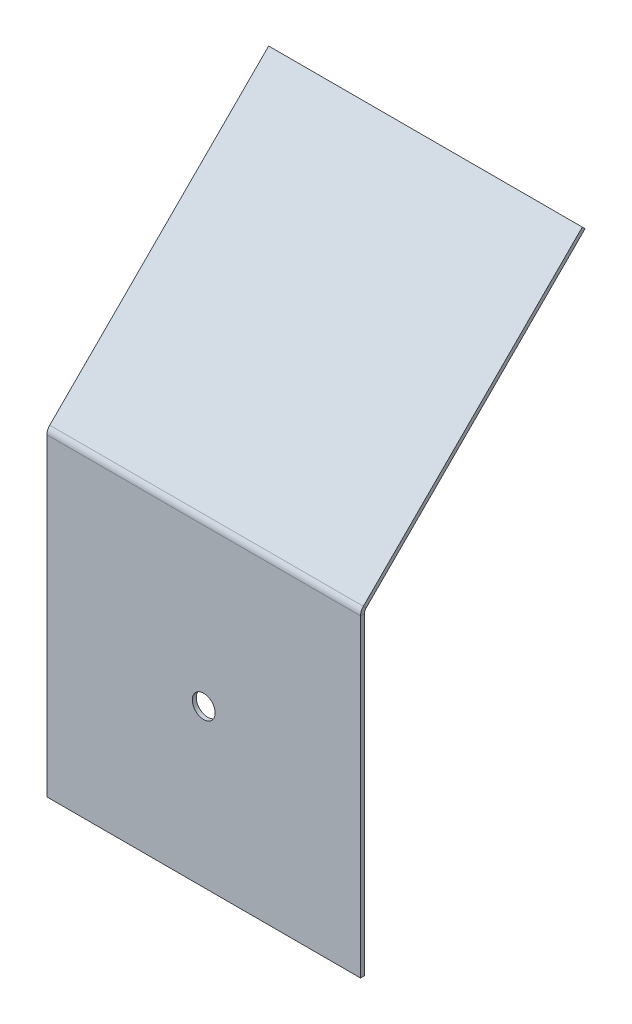
ISO-10303-21;
HEADER;
FILE_DESCRIPTION(('STEP AP214'),'2;1');
FILE_NAME('part.step','',(''),(''),'','','');
FILE_SCHEMA(('AUTOMOTIVE_DESIGN { 1 0 10303 214 1 1 1 1 }'));
ENDSEC;
DATA;
#1=APPLICATION_CONTEXT('core data for automotive mechanical design processes');
#2=APPLICATION_PROTOCOL_DEFINITION('international standard','automotive_design',2000,#1);
#3=PRODUCT_CONTEXT('',#1,'mechanical');
#4=PRODUCT('Part','Part','',(#3));
#5=PRODUCT_RELATED_PRODUCT_CATEGORY('part','',(#4));
#6=PRODUCT_DEFINITION_FORMATION('','',#4);
#7=PRODUCT_DEFINITION_CONTEXT('part definition',#1,'design');
#8=PRODUCT_DEFINITION('design','',#6,#7);
#9=PRODUCT_DEFINITION_SHAPE('','',#8);
#10=(LENGTH_UNIT() NAMED_UNIT(*) SI_UNIT(.MILLI.,.METRE.));
#11=(NAMED_UNIT(*) PLANE_ANGLE_UNIT() SI_UNIT($,.RADIAN.));
#12=(NAMED_UNIT(*) SI_UNIT($,.STERADIAN.) SOLID_ANGLE_UNIT());
#13=UNCERTAINTY_MEASURE_WITH_UNIT(LENGTH_MEASURE(1.E-05),#10,'distance_accuracy_value','');
#14=(GEOMETRIC_REPRESENTATION_CONTEXT(3) GLOBAL_UNCERTAINTY_ASSIGNED_CONTEXT((#13)) GLOBAL_UNIT_ASSIGNED_CONTEXT((#10,
#11,#12)) REPRESENTATION_CONTEXT('',''));
#15=CARTESIAN_POINT('',(0.,0.,0.));
#16=DIRECTION('',(0.,0.,1.));
#17=DIRECTION('',(1.,0.,0.));
#18=AXIS2_PLACEMENT_3D('',#15,#16,#17);
#19=CARTESIAN_POINT('',(27.5,-27.5,-0.7));
#20=DIRECTION('',(1.,0.,0.));
#21=DIRECTION('',(0.,0.,-1.));
#22=AXIS2_PLACEMENT_3D('',#19,#20,#21);
#23=PLANE('',#22);
#24=DIRECTION('',(0.,1.,0.));
#25=VECTOR('',#24,1.);
#26=CARTESIAN_POINT('',(27.5,-27.5,0.));
#27=LINE('',#26,#25);
#28=CARTESIAN_POINT('',(27.5,-27.5,0.));
#29=VERTEX_POINT('',#28);
#30=CARTESIAN_POINT('',(27.5,27.5,0.));
#31=VERTEX_POINT('',#30);
#32=EDGE_CURVE('E96',#29,#31,#27,.T.);
#33=ORIENTED_EDGE('',*,*,#32,.F.);
#34=DIRECTION('',(0.,0.,1.));
#35=VECTOR('',#34,1.);
#36=CARTESIAN_POINT('',(27.5,-27.5,-0.7));
#37=LINE('',#36,#35);
#38=CARTESIAN_POINT('',(27.5,-27.5,-0.7));
#39=VERTEX_POINT('',#38);
#40=EDGE_CURVE('E13',#39,#29,#37,.T.);
#41=ORIENTED_EDGE('',*,*,#40,.F.);
#42=DIRECTION('',(0.,1.,0.));
#43=VECTOR('',#42,1.);
#44=CARTESIAN_POINT('',(27.5,-27.5,-0.7));
#45=LINE('',#44,#43);
#46=CARTESIAN_POINT('',(27.5,27.5,-0.699999999999997));
#47=VERTEX_POINT('',#46);
#48=EDGE_CURVE('E105',#39,#47,#45,.T.);
#49=ORIENTED_EDGE('',*,*,#48,.T.);
#50=DIRECTION('',(0.,0.,1.));
#51=VECTOR('',#50,1.);
#52=CARTESIAN_POINT('',(27.5,27.5,-0.7));
#53=LINE('',#52,#51);
#54=EDGE_CURVE('E58',#47,#31,#53,.T.);
#55=ORIENTED_EDGE('',*,*,#54,.T.);
#56=EDGE_LOOP('',(#33,#41,#49,#55));
#57=FACE_BOUND('',#56,.T.);
#58=ADVANCED_FACE('F55',(#57),#23,.T.);
#59=CARTESIAN_POINT('',(-27.5,-27.5,-0.7));
#60=DIRECTION('',(0.,-1.,0.));
#61=DIRECTION('',(0.,0.,-1.));
#62=AXIS2_PLACEMENT_3D('',#59,#60,#61);
#63=PLANE('',#62);
#64=DIRECTION('',(1.,0.,0.));
#65=VECTOR('',#64,1.);
#66=CARTESIAN_POINT('',(-27.5,-27.5,0.));
#67=LINE('',#66,#65);
#68=CARTESIAN_POINT('',(-27.5,-27.5,0.));
#69=VERTEX_POINT('',#68);
#70=EDGE_CURVE('E91',#69,#29,#67,.T.);
#71=ORIENTED_EDGE('',*,*,#70,.F.);
#72=DIRECTION('',(0.,0.,1.));
#73=VECTOR('',#72,1.);
#74=CARTESIAN_POINT('',(-27.5,-27.5,-0.7));
#75=LINE('',#74,#73);
#76=CARTESIAN_POINT('',(-27.5,-27.5,-0.7));
#77=VERTEX_POINT('',#76);
#78=EDGE_CURVE('E64',#77,#69,#75,.T.);
#79=ORIENTED_EDGE('',*,*,#78,.F.);
#80=DIRECTION('',(1.,0.,0.));
#81=VECTOR('',#80,1.);
#82=CARTESIAN_POINT('',(-27.5,-27.5,-0.7));
#83=LINE('',#82,#81);
#84=EDGE_CURVE('E93',#77,#39,#83,.T.);
#85=ORIENTED_EDGE('',*,*,#84,.T.);
#86=ORIENTED_EDGE('',*,*,#40,.T.);
#87=EDGE_LOOP('',(#71,#79,#85,#86));
#88=FACE_BOUND('',#87,.T.);
#89=ADVANCED_FACE('F89',(#88),#63,.T.);
#90=CARTESIAN_POINT('',(-27.5,-27.5,-0.7));
#91=DIRECTION('',(-1.,0.,0.));
#92=DIRECTION('',(0.,0.,1.));
#93=AXIS2_PLACEMENT_3D('',#90,#91,#92);
#94=PLANE('',#93);
#95=DIRECTION('',(0.,-1.,0.));
#96=VECTOR('',#95,1.);
#97=CARTESIAN_POINT('',(-27.5,-27.5,0.));
#98=LINE('',#97,#96);
#99=CARTESIAN_POINT('',(-27.5,27.5,0.));
#100=VERTEX_POINT('',#99);
#101=EDGE_CURVE('E104',#100,#69,#98,.T.);
#102=ORIENTED_EDGE('',*,*,#101,.F.);
#103=DIRECTION('',(0.,0.,1.));
#104=VECTOR('',#103,1.);
#105=CARTESIAN_POINT('',(-27.5,27.5,-0.7));
#106=LINE('',#105,#104);
#107=CARTESIAN_POINT('',(-27.5,27.5,-0.700000000000002));
#108=VERTEX_POINT('',#107);
#109=EDGE_CURVE('E112',#108,#100,#106,.T.);
#110=ORIENTED_EDGE('',*,*,#109,.F.);
#111=DIRECTION('',(0.,-1.,0.));
#112=VECTOR('',#111,1.);
#113=CARTESIAN_POINT('',(-27.5,-27.5,-0.7));
#114=LINE('',#113,#112);
#115=EDGE_CURVE('E118',#108,#77,#114,.T.);
#116=ORIENTED_EDGE('',*,*,#115,.T.);
#117=ORIENTED_EDGE('',*,*,#78,.T.);
#118=EDGE_LOOP('',(#102,#110,#116,#117));
#119=FACE_BOUND('',#118,.T.);
#120=ADVANCED_FACE('F165',(#119),#94,.T.);
#121=CARTESIAN_POINT('',(0.,0.,-0.7));
#122=DIRECTION('',(0.,0.,-1.));
#123=DIRECTION('',(-1.,0.,0.));
#124=AXIS2_PLACEMENT_3D('',#121,#122,#123);
#125=PLANE('',#124);
#126=CARTESIAN_POINT('',(0.,0.,-0.699999999999999));
#127=DIRECTION('',(0.,0.,-1.));
#128=DIRECTION('',(-1.,0.,0.));
#129=AXIS2_PLACEMENT_3D('',#126,#127,#128);
#130=CIRCLE('',#129,2.);
#131=CARTESIAN_POINT('',(-2.,0.,-0.699999999999999));
#132=VERTEX_POINT('',#131);
#133=EDGE_CURVE('E198',#132,#132,#130,.T.);
#134=ORIENTED_EDGE('',*,*,#133,.F.);
#135=EDGE_LOOP('',(#134));
#136=FACE_BOUND('',#135,.T.);
#137=ORIENTED_EDGE('',*,*,#48,.F.);
#138=ORIENTED_EDGE('',*,*,#84,.F.);
#139=ORIENTED_EDGE('',*,*,#115,.F.);
#140=DIRECTION('',(-1.,0.,0.));
#141=VECTOR('',#140,1.);
#142=CARTESIAN_POINT('',(-27.5,27.5,-0.7));
#143=LINE('',#142,#141);
#144=EDGE_CURVE('E107',#47,#108,#143,.T.);
#145=ORIENTED_EDGE('',*,*,#144,.F.);
#146=EDGE_LOOP('',(#137,#138,#139,#145));
#147=FACE_BOUND('',#146,.T.);
#148=ADVANCED_FACE('F166',(#136,#147),#125,.T.);
#149=CARTESIAN_POINT('',(0.,0.,0.));
#150=DIRECTION('',(0.,0.,-1.));
#151=DIRECTION('',(-1.,0.,0.));
#152=AXIS2_PLACEMENT_3D('',#149,#150,#151);
#153=PLANE('',#152);
#154=CARTESIAN_POINT('',(0.,0.,0.));
#155=DIRECTION('',(0.,0.,1.));
#156=DIRECTION('',(1.,0.,0.));
#157=AXIS2_PLACEMENT_3D('',#154,#155,#156);
#158=CIRCLE('',#157,2.);
#159=CARTESIAN_POINT('',(2.,0.,0.));
#160=VERTEX_POINT('',#159);
#161=EDGE_CURVE('E228',#160,#160,#158,.T.);
#162=ORIENTED_EDGE('',*,*,#161,.F.);
#163=EDGE_LOOP('',(#162));
#164=FACE_BOUND('',#163,.T.);
#165=ORIENTED_EDGE('',*,*,#32,.T.);
#166=DIRECTION('',(-1.,0.,0.));
#167=VECTOR('',#166,1.);
#168=CARTESIAN_POINT('',(-27.5,27.5,0.));
#169=LINE('',#168,#167);
#170=EDGE_CURVE('E100',#31,#100,#169,.T.);
#171=ORIENTED_EDGE('',*,*,#170,.T.);
#172=ORIENTED_EDGE('',*,*,#101,.T.);
#173=ORIENTED_EDGE('',*,*,#70,.T.);
#174=EDGE_LOOP('',(#165,#171,#172,#173));
#175=FACE_BOUND('',#174,.T.);
#176=ADVANCED_FACE('F103',(#164,#175),#153,.F.);
#177=CARTESIAN_POINT('',(-27.5,27.5,-1.7));
#178=DIRECTION('',(-1.,0.,0.));
#179=DIRECTION('',(0.,0.,1.));
#180=AXIS2_PLACEMENT_3D('',#177,#178,#179);
#181=PLANE('',#180);
#182=DIRECTION('',(0.,0.707106781186544,0.707106781186551));
#183=VECTOR('',#182,1.);
#184=CARTESIAN_POINT('',(-27.5,28.7020815280171,-0.497918471982862));
#185=LINE('',#184,#183);
#186=CARTESIAN_POINT('',(-27.5,28.2071067811865,-0.99289321881345));
#187=VERTEX_POINT('',#186);
#188=CARTESIAN_POINT('',(-27.5,28.7020815280171,-0.497918471982864));
#189=VERTEX_POINT('',#188);
#190=EDGE_CURVE('E164',#187,#189,#185,.T.);
#191=ORIENTED_EDGE('',*,*,#190,.F.);
#192=CARTESIAN_POINT('',(-27.5,27.5,-1.7));
#193=DIRECTION('',(1.,0.,0.));
#194=DIRECTION('',(0.,0.,-1.));
#195=AXIS2_PLACEMENT_3D('',#192,#193,#194);
#196=CIRCLE('',#195,0.999999999999998);
#197=EDGE_CURVE('E141',#108,#187,#196,.F.);
#198=ORIENTED_EDGE('',*,*,#197,.F.);
#199=ORIENTED_EDGE('',*,*,#109,.T.);
#200=CARTESIAN_POINT('',(-27.5,27.5,-1.7));
#201=DIRECTION('',(1.,0.,0.));
#202=DIRECTION('',(0.,0.,-1.));
#203=AXIS2_PLACEMENT_3D('',#200,#201,#202);
#204=CIRCLE('',#203,1.7);
#205=EDGE_CURVE('E101',#100,#189,#204,.F.);
#206=ORIENTED_EDGE('',*,*,#205,.T.);
#207=EDGE_LOOP('',(#191,#198,#199,#206));
#208=FACE_BOUND('',#207,.T.);
#209=ADVANCED_FACE('F162',(#208),#181,.T.);
#210=CARTESIAN_POINT('',(27.5,27.5,-1.69999999999999));
#211=DIRECTION('',(-1.,0.,0.));
#212=DIRECTION('',(0.,0.,1.));
#213=AXIS2_PLACEMENT_3D('',#210,#211,#212);
#214=PLANE('',#213);
#215=CARTESIAN_POINT('',(27.5,27.5,-1.69999999999999));
#216=DIRECTION('',(1.,0.,0.));
#217=DIRECTION('',(0.,0.,-1.));
#218=AXIS2_PLACEMENT_3D('',#215,#216,#217);
#219=CIRCLE('',#218,0.999999999999998);
#220=CARTESIAN_POINT('',(27.5,28.2071067811865,-0.992893218813445));
#221=VERTEX_POINT('',#220);
#222=EDGE_CURVE('E145',#221,#47,#219,.T.);
#223=ORIENTED_EDGE('',*,*,#222,.F.);
#224=DIRECTION('',(0.,0.707106781186544,0.707106781186551));
#225=VECTOR('',#224,1.);
#226=CARTESIAN_POINT('',(27.5,28.2071067811865,-0.992893218813448));
#227=LINE('',#226,#225);
#228=CARTESIAN_POINT('',(27.5,28.7020815280171,-0.497918471982861));
#229=VERTEX_POINT('',#228);
#230=EDGE_CURVE('E139',#221,#229,#227,.T.);
#231=ORIENTED_EDGE('',*,*,#230,.T.);
#232=CARTESIAN_POINT('',(27.5,27.5,-1.69999999999999));
#233=DIRECTION('',(1.,0.,0.));
#234=DIRECTION('',(0.,0.,-1.));
#235=AXIS2_PLACEMENT_3D('',#232,#233,#234);
#236=CIRCLE('',#235,1.7);
#237=EDGE_CURVE('E129',#229,#31,#236,.T.);
#238=ORIENTED_EDGE('',*,*,#237,.T.);
#239=ORIENTED_EDGE('',*,*,#54,.F.);
#240=EDGE_LOOP('',(#223,#231,#238,#239));
#241=FACE_BOUND('',#240,.T.);
#242=ADVANCED_FACE('F135',(#241),#214,.F.);
#243=CARTESIAN_POINT('',(27.5,27.5,-1.69999999999999));
#244=DIRECTION('',(1.,0.,0.));
#245=DIRECTION('',(0.,0.707106781186544,0.707106781186551));
#246=AXIS2_PLACEMENT_3D('',#243,#244,#245);
#247=CYLINDRICAL_SURFACE('',#246,1.7);
#248=ORIENTED_EDGE('',*,*,#170,.F.);
#249=ORIENTED_EDGE('',*,*,#237,.F.);
#250=DIRECTION('',(1.,0.,0.));
#251=VECTOR('',#250,1.);
#252=CARTESIAN_POINT('',(0.,28.7020815280171,-0.497918471982861));
#253=LINE('',#252,#251);
#254=EDGE_CURVE('E184',#189,#229,#253,.T.);
#255=ORIENTED_EDGE('',*,*,#254,.F.);
#256=ORIENTED_EDGE('',*,*,#205,.F.);
#257=EDGE_LOOP('',(#248,#249,#255,#256));
#258=FACE_BOUND('',#257,.T.);
#259=ADVANCED_FACE('F126',(#258),#247,.T.);
#260=CARTESIAN_POINT('',(27.5,27.5,-1.69999999999999));
#261=DIRECTION('',(1.,0.,0.));
#262=DIRECTION('',(0.,0.707106781186544,0.707106781186551));
#263=AXIS2_PLACEMENT_3D('',#260,#261,#262);
#264=CYLINDRICAL_SURFACE('',#263,0.999999999999998);
#265=ORIENTED_EDGE('',*,*,#144,.T.);
#266=ORIENTED_EDGE('',*,*,#197,.T.);
#267=DIRECTION('',(-1.,0.,0.));
#268=VECTOR('',#267,1.);
#269=CARTESIAN_POINT('',(-27.5,28.2071067811865,-0.992893218813448));
#270=LINE('',#269,#268);
#271=EDGE_CURVE('E197',#187,#221,#270,.F.);
#272=ORIENTED_EDGE('',*,*,#271,.T.);
#273=ORIENTED_EDGE('',*,*,#222,.T.);
#274=EDGE_LOOP('',(#265,#266,#272,#273));
#275=FACE_BOUND('',#274,.T.);
#276=ADVANCED_FACE('F154',(#275),#264,.F.);
#277=CARTESIAN_POINT('',(27.5,28.4091883092037,-0.205025253169415));
#278=DIRECTION('',(1.,0.,0.));
#279=DIRECTION('',(0.,0.,-1.));
#280=AXIS2_PLACEMENT_3D('',#277,#278,#279);
#281=PLANE('',#280);
#282=DIRECTION('',(0.,-0.707106781186551,0.707106781186544));
#283=VECTOR('',#282,1.);
#284=CARTESIAN_POINT('',(27.5,28.4091883092037,-0.205025253169416));
#285=LINE('',#284,#283);
#286=CARTESIAN_POINT('',(27.5,67.0950360212946,-38.8908729652599));
#287=VERTEX_POINT('',#286);
#288=EDGE_CURVE('E205',#287,#229,#285,.T.);
#289=ORIENTED_EDGE('',*,*,#288,.T.);
#290=ORIENTED_EDGE('',*,*,#230,.F.);
#291=DIRECTION('',(0.,0.707106781186551,-0.707106781186544));
#292=VECTOR('',#291,1.);
#293=CARTESIAN_POINT('',(27.5,13.8142135623729,13.4));
#294=LINE('',#293,#292);
#295=CARTESIAN_POINT('',(27.5,66.600061274464,-39.3858477120905));
#296=VERTEX_POINT('',#295);
#297=EDGE_CURVE('E203',#296,#221,#294,.F.);
#298=ORIENTED_EDGE('',*,*,#297,.F.);
#299=DIRECTION('',(0.,-0.707106781186544,-0.707106781186551));
#300=VECTOR('',#299,1.);
#301=CARTESIAN_POINT('',(27.5,67.0950360212946,-38.8908729652599));
#302=LINE('',#301,#300);
#303=EDGE_CURVE('E149',#287,#296,#302,.T.);
#304=ORIENTED_EDGE('',*,*,#303,.F.);
#305=EDGE_LOOP('',(#289,#290,#298,#304));
#306=FACE_BOUND('',#305,.T.);
#307=ADVANCED_FACE('F221',(#306),#281,.T.);
#308=CARTESIAN_POINT('',(-27.5,67.0950360212946,-38.8908729652599));
#309=DIRECTION('',(-1.,0.,0.));
#310=DIRECTION('',(0.,0.,1.));
#311=AXIS2_PLACEMENT_3D('',#308,#309,#310);
#312=PLANE('',#311);
#313=DIRECTION('',(0.,-0.707106781186551,0.707106781186544));
#314=VECTOR('',#313,1.);
#315=CARTESIAN_POINT('',(-27.5,13.8142135623729,13.4));
#316=LINE('',#315,#314);
#317=CARTESIAN_POINT('',(-27.5,66.600061274464,-39.3858477120905));
#318=VERTEX_POINT('',#317);
#319=EDGE_CURVE('E189',#187,#318,#316,.F.);
#320=ORIENTED_EDGE('',*,*,#319,.F.);
#321=ORIENTED_EDGE('',*,*,#190,.T.);
#322=DIRECTION('',(0.,0.707106781186551,-0.707106781186544));
#323=VECTOR('',#322,1.);
#324=CARTESIAN_POINT('',(-27.5,67.0950360212946,-38.8908729652599));
#325=LINE('',#324,#323);
#326=CARTESIAN_POINT('',(-27.5,67.0950360212946,-38.8908729652599));
#327=VERTEX_POINT('',#326);
#328=EDGE_CURVE('E195',#189,#327,#325,.T.);
#329=ORIENTED_EDGE('',*,*,#328,.T.);
#330=DIRECTION('',(0.,-0.707106781186544,-0.707106781186551));
#331=VECTOR('',#330,1.);
#332=CARTESIAN_POINT('',(-27.5,67.0950360212946,-38.8908729652599));
#333=LINE('',#332,#331);
#334=EDGE_CURVE('E222',#327,#318,#333,.T.);
#335=ORIENTED_EDGE('',*,*,#334,.T.);
#336=EDGE_LOOP('',(#320,#321,#329,#335));
#337=FACE_BOUND('',#336,.T.);
#338=ADVANCED_FACE('F193',(#337),#312,.T.);
#339=CARTESIAN_POINT('',(0.,14.3091883092035,13.8949747468306));
#340=DIRECTION('',(0.,0.707106781186544,0.707106781186551));
#341=DIRECTION('',(0.,-0.707106781186551,0.707106781186544));
#342=AXIS2_PLACEMENT_3D('',#339,#340,#341);
#343=PLANE('',#342);
#344=ORIENTED_EDGE('',*,*,#328,.F.);
#345=ORIENTED_EDGE('',*,*,#254,.T.);
#346=ORIENTED_EDGE('',*,*,#288,.F.);
#347=DIRECTION('',(1.,0.,0.));
#348=VECTOR('',#347,1.);
#349=CARTESIAN_POINT('',(27.5,67.0950360212946,-38.8908729652599));
#350=LINE('',#349,#348);
#351=EDGE_CURVE('E202',#327,#287,#350,.T.);
#352=ORIENTED_EDGE('',*,*,#351,.F.);
#353=EDGE_LOOP('',(#344,#345,#346,#352));
#354=FACE_BOUND('',#353,.T.);
#355=ADVANCED_FACE('F200',(#354),#343,.T.);
#356=CARTESIAN_POINT('',(0.,13.8142135623729,13.4));
#357=DIRECTION('',(0.,0.707106781186544,0.707106781186551));
#358=DIRECTION('',(0.,-0.707106781186551,0.707106781186544));
#359=AXIS2_PLACEMENT_3D('',#356,#357,#358);
#360=PLANE('',#359);
#361=ORIENTED_EDGE('',*,*,#271,.F.);
#362=ORIENTED_EDGE('',*,*,#319,.T.);
#363=DIRECTION('',(-1.,0.,0.));
#364=VECTOR('',#363,1.);
#365=CARTESIAN_POINT('',(0.,66.600061274464,-39.3858477120905));
#366=LINE('',#365,#364);
#367=EDGE_CURVE('E208',#318,#296,#366,.F.);
#368=ORIENTED_EDGE('',*,*,#367,.T.);
#369=ORIENTED_EDGE('',*,*,#297,.T.);
#370=EDGE_LOOP('',(#361,#362,#368,#369));
#371=FACE_BOUND('',#370,.T.);
#372=ADVANCED_FACE('F218',(#371),#360,.F.);
#373=CARTESIAN_POINT('',(27.5,67.0950360212946,-38.8908729652599));
#374=DIRECTION('',(0.,0.707106781186551,-0.707106781186544));
#375=DIRECTION('',(0.,0.707106781186544,0.707106781186551));
#376=AXIS2_PLACEMENT_3D('',#373,#374,#375);
#377=PLANE('',#376);
#378=ORIENTED_EDGE('',*,*,#367,.F.);
#379=ORIENTED_EDGE('',*,*,#334,.F.);
#380=ORIENTED_EDGE('',*,*,#351,.T.);
#381=ORIENTED_EDGE('',*,*,#303,.T.);
#382=EDGE_LOOP('',(#378,#379,#380,#381));
#383=FACE_BOUND('',#382,.T.);
#384=ADVANCED_FACE('F265',(#383),#377,.T.);
#385=CARTESIAN_POINT('',(0.,0.,-10.));
#386=DIRECTION('',(0.,0.,1.));
#387=DIRECTION('',(1.,0.,0.));
#388=AXIS2_PLACEMENT_3D('',#385,#386,#387);
#389=CYLINDRICAL_SURFACE('',#388,2.);
#390=ORIENTED_EDGE('',*,*,#133,.T.);
#391=EDGE_LOOP('',(#390));
#392=FACE_BOUND('',#391,.T.);
#393=ORIENTED_EDGE('',*,*,#161,.T.);
#394=EDGE_LOOP('',(#393));
#395=FACE_BOUND('',#394,.T.);
#396=ADVANCED_FACE('F232',(#392,#395),#389,.F.);
#397=CLOSED_SHELL('',(#58,#89,#120,#148,#176,#209,#242,#259,#276,#307,#338,#355,#372,#384,#396));
#398=MANIFOLD_SOLID_BREP('B2',#397);
#399=ADVANCED_BREP_SHAPE_REPRESENTATION('',(#18,#398),#14);
#400=SHAPE_DEFINITION_REPRESENTATION(#9,#399);
ENDSEC;
END-ISO-10303-21;
